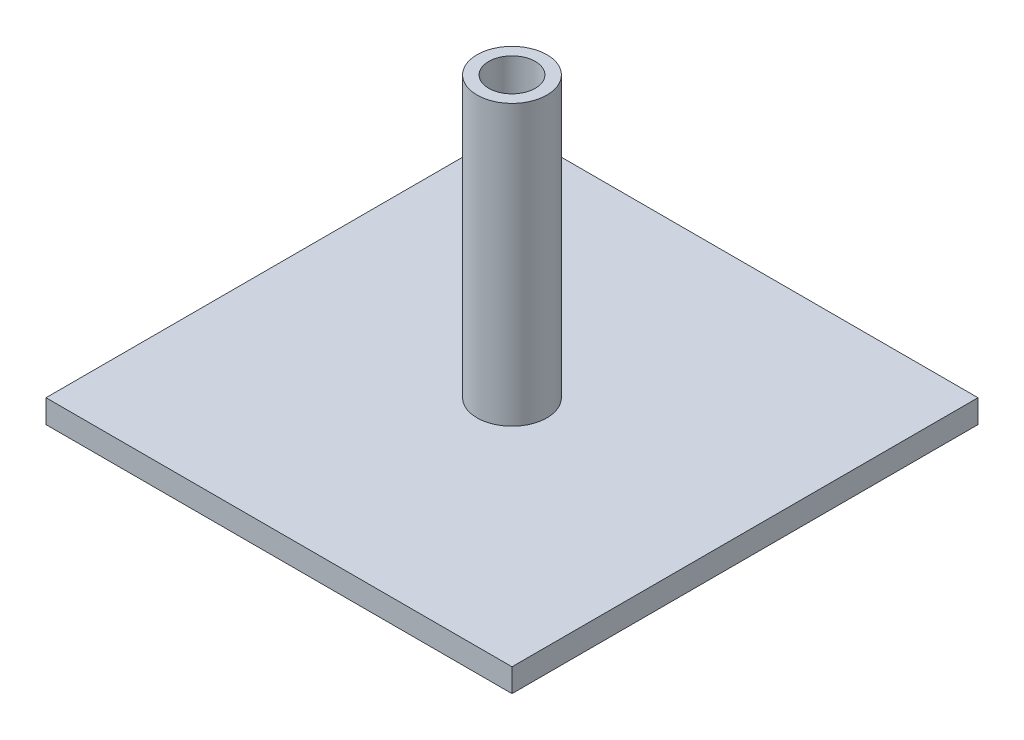
ISO-10303-21;
HEADER;
FILE_DESCRIPTION(('STEP AP214'),'2;1');
FILE_NAME('part.step','',(''),(''),'','','');
FILE_SCHEMA(('AUTOMOTIVE_DESIGN { 1 0 10303 214 1 1 1 1 }'));
ENDSEC;
DATA;
#1=APPLICATION_CONTEXT('core data for automotive mechanical design processes');
#2=APPLICATION_PROTOCOL_DEFINITION('international standard','automotive_design',2000,#1);
#3=PRODUCT_CONTEXT('',#1,'mechanical');
#4=PRODUCT('Part','Part','',(#3));
#5=PRODUCT_RELATED_PRODUCT_CATEGORY('part','',(#4));
#6=PRODUCT_DEFINITION_FORMATION('','',#4);
#7=PRODUCT_DEFINITION_CONTEXT('part definition',#1,'design');
#8=PRODUCT_DEFINITION('design','',#6,#7);
#9=PRODUCT_DEFINITION_SHAPE('','',#8);
#10=(LENGTH_UNIT() NAMED_UNIT(*) SI_UNIT(.MILLI.,.METRE.));
#11=(NAMED_UNIT(*) PLANE_ANGLE_UNIT() SI_UNIT($,.RADIAN.));
#12=(NAMED_UNIT(*) SI_UNIT($,.STERADIAN.) SOLID_ANGLE_UNIT());
#13=UNCERTAINTY_MEASURE_WITH_UNIT(LENGTH_MEASURE(1.E-05),#10,'distance_accuracy_value','');
#14=(GEOMETRIC_REPRESENTATION_CONTEXT(3) GLOBAL_UNCERTAINTY_ASSIGNED_CONTEXT((#13)) GLOBAL_UNIT_ASSIGNED_CONTEXT((#10,
#11,#12)) REPRESENTATION_CONTEXT('',''));
#15=CARTESIAN_POINT('',(0.,0.,0.));
#16=DIRECTION('',(0.,0.,1.));
#17=DIRECTION('',(1.,0.,0.));
#18=AXIS2_PLACEMENT_3D('',#15,#16,#17);
#19=CARTESIAN_POINT('',(0.,0.,0.));
#20=DIRECTION('',(0.,1.,0.));
#21=DIRECTION('',(0.,0.,1.));
#22=AXIS2_PLACEMENT_3D('',#19,#20,#21);
#23=PLANE('',#22);
#24=DIRECTION('',(0.,0.,-1.));
#25=VECTOR('',#24,1.);
#26=CARTESIAN_POINT('',(50.,0.,-50.));
#27=LINE('',#26,#25);
#28=CARTESIAN_POINT('',(50.,0.,50.));
#29=VERTEX_POINT('',#28);
#30=CARTESIAN_POINT('',(50.,0.,-50.));
#31=VERTEX_POINT('',#30);
#32=EDGE_CURVE('E101',#29,#31,#27,.T.);
#33=ORIENTED_EDGE('',*,*,#32,.T.);
#34=DIRECTION('',(-1.,0.,0.));
#35=VECTOR('',#34,1.);
#36=CARTESIAN_POINT('',(-50.,0.,-50.));
#37=LINE('',#36,#35);
#38=CARTESIAN_POINT('',(-50.,0.,-50.));
#39=VERTEX_POINT('',#38);
#40=EDGE_CURVE('E104',#31,#39,#37,.T.);
#41=ORIENTED_EDGE('',*,*,#40,.T.);
#42=DIRECTION('',(0.,0.,1.));
#43=VECTOR('',#42,1.);
#44=CARTESIAN_POINT('',(-50.,0.,-50.));
#45=LINE('',#44,#43);
#46=CARTESIAN_POINT('',(-50.,0.,50.));
#47=VERTEX_POINT('',#46);
#48=EDGE_CURVE('E85',#39,#47,#45,.T.);
#49=ORIENTED_EDGE('',*,*,#48,.T.);
#50=DIRECTION('',(1.,0.,0.));
#51=VECTOR('',#50,1.);
#52=CARTESIAN_POINT('',(-50.,0.,50.));
#53=LINE('',#52,#51);
#54=EDGE_CURVE('E96',#47,#29,#53,.T.);
#55=ORIENTED_EDGE('',*,*,#54,.T.);
#56=EDGE_LOOP('',(#33,#41,#49,#55));
#57=FACE_BOUND('',#56,.T.);
#58=CARTESIAN_POINT('',(0.,0.,0.));
#59=DIRECTION('',(0.,1.,0.));
#60=DIRECTION('',(0.,0.,1.));
#61=AXIS2_PLACEMENT_3D('',#58,#59,#60);
#62=CIRCLE('',#61,7.5);
#63=CARTESIAN_POINT('',(0.,0.,7.5));
#64=VERTEX_POINT('',#63);
#65=EDGE_CURVE('E207',#64,#64,#62,.T.);
#66=ORIENTED_EDGE('',*,*,#65,.F.);
#67=EDGE_LOOP('',(#66));
#68=FACE_BOUND('',#67,.T.);
#69=ADVANCED_FACE('F33',(#57,#68),#23,.T.);
#70=CARTESIAN_POINT('',(50.,-5.,-50.));
#71=DIRECTION('',(1.,0.,0.));
#72=DIRECTION('',(0.,0.,-1.));
#73=AXIS2_PLACEMENT_3D('',#70,#71,#72);
#74=PLANE('',#73);
#75=ORIENTED_EDGE('',*,*,#32,.F.);
#76=DIRECTION('',(0.,1.,0.));
#77=VECTOR('',#76,1.);
#78=CARTESIAN_POINT('',(50.,-5.,50.));
#79=LINE('',#78,#77);
#80=CARTESIAN_POINT('',(50.,-5.,50.));
#81=VERTEX_POINT('',#80);
#82=EDGE_CURVE('E42',#81,#29,#79,.T.);
#83=ORIENTED_EDGE('',*,*,#82,.F.);
#84=DIRECTION('',(0.,0.,-1.));
#85=VECTOR('',#84,1.);
#86=CARTESIAN_POINT('',(50.,-5.,-50.));
#87=LINE('',#86,#85);
#88=CARTESIAN_POINT('',(50.,-5.,-50.));
#89=VERTEX_POINT('',#88);
#90=EDGE_CURVE('E94',#81,#89,#87,.T.);
#91=ORIENTED_EDGE('',*,*,#90,.T.);
#92=DIRECTION('',(0.,1.,0.));
#93=VECTOR('',#92,1.);
#94=CARTESIAN_POINT('',(50.,-5.,-50.));
#95=LINE('',#94,#93);
#96=EDGE_CURVE('E77',#89,#31,#95,.T.);
#97=ORIENTED_EDGE('',*,*,#96,.T.);
#98=EDGE_LOOP('',(#75,#83,#91,#97));
#99=FACE_BOUND('',#98,.T.);
#100=ADVANCED_FACE('F35',(#99),#74,.T.);
#101=CARTESIAN_POINT('',(-50.,-5.,50.));
#102=DIRECTION('',(0.,0.,1.));
#103=DIRECTION('',(1.,0.,0.));
#104=AXIS2_PLACEMENT_3D('',#101,#102,#103);
#105=PLANE('',#104);
#106=ORIENTED_EDGE('',*,*,#54,.F.);
#107=DIRECTION('',(0.,1.,0.));
#108=VECTOR('',#107,1.);
#109=CARTESIAN_POINT('',(-50.,-5.,50.));
#110=LINE('',#109,#108);
#111=CARTESIAN_POINT('',(-50.,-5.,50.));
#112=VERTEX_POINT('',#111);
#113=EDGE_CURVE('E66',#112,#47,#110,.T.);
#114=ORIENTED_EDGE('',*,*,#113,.F.);
#115=DIRECTION('',(1.,0.,0.));
#116=VECTOR('',#115,1.);
#117=CARTESIAN_POINT('',(-50.,-5.,50.));
#118=LINE('',#117,#116);
#119=EDGE_CURVE('E91',#112,#81,#118,.T.);
#120=ORIENTED_EDGE('',*,*,#119,.T.);
#121=ORIENTED_EDGE('',*,*,#82,.T.);
#122=EDGE_LOOP('',(#106,#114,#120,#121));
#123=FACE_BOUND('',#122,.T.);
#124=ADVANCED_FACE('F113',(#123),#105,.T.);
#125=CARTESIAN_POINT('',(-50.,-5.,-50.));
#126=DIRECTION('',(-1.,0.,0.));
#127=DIRECTION('',(0.,0.,1.));
#128=AXIS2_PLACEMENT_3D('',#125,#126,#127);
#129=PLANE('',#128);
#130=ORIENTED_EDGE('',*,*,#48,.F.);
#131=DIRECTION('',(0.,1.,0.));
#132=VECTOR('',#131,1.);
#133=CARTESIAN_POINT('',(-50.,-5.,-50.));
#134=LINE('',#133,#132);
#135=CARTESIAN_POINT('',(-50.,-5.,-50.));
#136=VERTEX_POINT('',#135);
#137=EDGE_CURVE('E80',#136,#39,#134,.T.);
#138=ORIENTED_EDGE('',*,*,#137,.F.);
#139=DIRECTION('',(0.,0.,1.));
#140=VECTOR('',#139,1.);
#141=CARTESIAN_POINT('',(-50.,-5.,-50.));
#142=LINE('',#141,#140);
#143=EDGE_CURVE('E83',#136,#112,#142,.T.);
#144=ORIENTED_EDGE('',*,*,#143,.T.);
#145=ORIENTED_EDGE('',*,*,#113,.T.);
#146=EDGE_LOOP('',(#130,#138,#144,#145));
#147=FACE_BOUND('',#146,.T.);
#148=ADVANCED_FACE('F82',(#147),#129,.T.);
#149=CARTESIAN_POINT('',(-50.,-5.,-50.));
#150=DIRECTION('',(0.,0.,-1.));
#151=DIRECTION('',(-1.,0.,0.));
#152=AXIS2_PLACEMENT_3D('',#149,#150,#151);
#153=PLANE('',#152);
#154=ORIENTED_EDGE('',*,*,#40,.F.);
#155=ORIENTED_EDGE('',*,*,#96,.F.);
#156=DIRECTION('',(-1.,0.,0.));
#157=VECTOR('',#156,1.);
#158=CARTESIAN_POINT('',(-50.,-5.,-50.));
#159=LINE('',#158,#157);
#160=EDGE_CURVE('E90',#89,#136,#159,.T.);
#161=ORIENTED_EDGE('',*,*,#160,.T.);
#162=ORIENTED_EDGE('',*,*,#137,.T.);
#163=EDGE_LOOP('',(#154,#155,#161,#162));
#164=FACE_BOUND('',#163,.T.);
#165=ADVANCED_FACE('F93',(#164),#153,.T.);
#166=CARTESIAN_POINT('',(0.,-5.,0.));
#167=DIRECTION('',(0.,1.,0.));
#168=DIRECTION('',(0.,0.,1.));
#169=AXIS2_PLACEMENT_3D('',#166,#167,#168);
#170=PLANE('',#169);
#171=ORIENTED_EDGE('',*,*,#90,.F.);
#172=ORIENTED_EDGE('',*,*,#119,.F.);
#173=ORIENTED_EDGE('',*,*,#143,.F.);
#174=ORIENTED_EDGE('',*,*,#160,.F.);
#175=EDGE_LOOP('',(#171,#172,#173,#174));
#176=FACE_BOUND('',#175,.T.);
#177=ADVANCED_FACE('F89',(#176),#170,.F.);
#178=CARTESIAN_POINT('',(0.,60.,0.));
#179=DIRECTION('',(0.,1.,0.));
#180=DIRECTION('',(0.,0.,1.));
#181=AXIS2_PLACEMENT_3D('',#178,#179,#180);
#182=PLANE('',#181);
#183=CARTESIAN_POINT('',(0.,60.,0.));
#184=DIRECTION('',(0.,1.,0.));
#185=DIRECTION('',(0.,0.,1.));
#186=AXIS2_PLACEMENT_3D('',#183,#184,#185);
#187=CIRCLE('',#186,7.5);
#188=CARTESIAN_POINT('',(0.,60.,7.5));
#189=VERTEX_POINT('',#188);
#190=EDGE_CURVE('E105',#189,#189,#187,.T.);
#191=ORIENTED_EDGE('',*,*,#190,.T.);
#192=EDGE_LOOP('',(#191));
#193=FACE_BOUND('',#192,.T.);
#194=CARTESIAN_POINT('',(0.,60.,0.));
#195=DIRECTION('',(0.,1.,0.));
#196=DIRECTION('',(0.,0.,1.));
#197=AXIS2_PLACEMENT_3D('',#194,#195,#196);
#198=CIRCLE('',#197,5.);
#199=CARTESIAN_POINT('',(0.,60.,5.));
#200=VERTEX_POINT('',#199);
#201=EDGE_CURVE('E206',#200,#200,#198,.T.);
#202=ORIENTED_EDGE('',*,*,#201,.F.);
#203=EDGE_LOOP('',(#202));
#204=FACE_BOUND('',#203,.T.);
#205=ADVANCED_FACE('F141',(#193,#204),#182,.T.);
#206=CARTESIAN_POINT('',(0.,60.,0.));
#207=DIRECTION('',(0.,-1.,0.));
#208=DIRECTION('',(0.,0.,-1.));
#209=AXIS2_PLACEMENT_3D('',#206,#207,#208);
#210=CYLINDRICAL_SURFACE('',#209,7.5);
#211=ORIENTED_EDGE('',*,*,#190,.F.);
#212=EDGE_LOOP('',(#211));
#213=FACE_BOUND('',#212,.T.);
#214=ORIENTED_EDGE('',*,*,#65,.T.);
#215=EDGE_LOOP('',(#214));
#216=FACE_BOUND('',#215,.T.);
#217=ADVANCED_FACE('F133',(#213,#216),#210,.T.);
#218=CARTESIAN_POINT('',(0.,60.,0.));
#219=DIRECTION('',(0.,-1.,0.));
#220=DIRECTION('',(0.,0.,-1.));
#221=AXIS2_PLACEMENT_3D('',#218,#219,#220);
#222=CYLINDRICAL_SURFACE('',#221,5.);
#223=ORIENTED_EDGE('',*,*,#201,.T.);
#224=EDGE_LOOP('',(#223));
#225=FACE_BOUND('',#224,.T.);
#226=CARTESIAN_POINT('',(0.,0.,0.));
#227=DIRECTION('',(0.,1.,0.));
#228=DIRECTION('',(0.,0.,1.));
#229=AXIS2_PLACEMENT_3D('',#226,#227,#228);
#230=CIRCLE('',#229,5.);
#231=CARTESIAN_POINT('',(0.,0.,5.));
#232=VERTEX_POINT('',#231);
#233=EDGE_CURVE('E11',#232,#232,#230,.F.);
#234=ORIENTED_EDGE('',*,*,#233,.T.);
#235=EDGE_LOOP('',(#234));
#236=FACE_BOUND('',#235,.T.);
#237=ADVANCED_FACE('F128',(#225,#236),#222,.F.);
#238=ORIENTED_EDGE('',*,*,#233,.F.);
#239=EDGE_LOOP('',(#238));
#240=FACE_BOUND('',#239,.T.);
#241=ADVANCED_FACE('F123',(#240),#23,.T.);
#242=CLOSED_SHELL('',(#69,#100,#124,#148,#165,#177,#205,#217,#237,#241));
#243=MANIFOLD_SOLID_BREP('B2',#242);
#244=ADVANCED_BREP_SHAPE_REPRESENTATION('',(#18,#243),#14);
#245=SHAPE_DEFINITION_REPRESENTATION(#9,#244);
ENDSEC;
END-ISO-10303-21;
